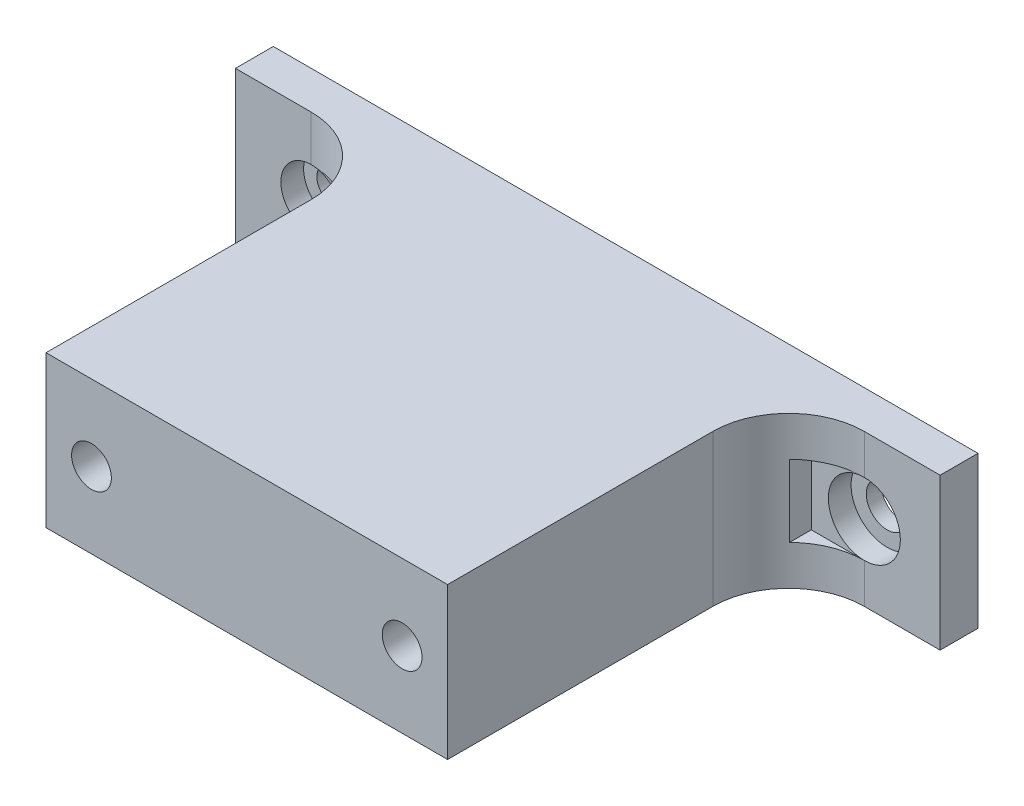
ISO-10303-21;
HEADER;
FILE_DESCRIPTION(('STEP AP214'),'2;1');
FILE_NAME('part.step','',(''),(''),'','','');
FILE_SCHEMA(('AUTOMOTIVE_DESIGN { 1 0 10303 214 1 1 1 1 }'));
ENDSEC;
DATA;
#1=APPLICATION_CONTEXT('core data for automotive mechanical design processes');
#2=APPLICATION_PROTOCOL_DEFINITION('international standard','automotive_design',2000,#1);
#3=PRODUCT_CONTEXT('',#1,'mechanical');
#4=PRODUCT('Part','Part','',(#3));
#5=PRODUCT_RELATED_PRODUCT_CATEGORY('part','',(#4));
#6=PRODUCT_DEFINITION_FORMATION('','',#4);
#7=PRODUCT_DEFINITION_CONTEXT('part definition',#1,'design');
#8=PRODUCT_DEFINITION('design','',#6,#7);
#9=PRODUCT_DEFINITION_SHAPE('','',#8);
#10=(LENGTH_UNIT() NAMED_UNIT(*) SI_UNIT(.MILLI.,.METRE.));
#11=(NAMED_UNIT(*) PLANE_ANGLE_UNIT() SI_UNIT($,.RADIAN.));
#12=(NAMED_UNIT(*) SI_UNIT($,.STERADIAN.) SOLID_ANGLE_UNIT());
#13=UNCERTAINTY_MEASURE_WITH_UNIT(LENGTH_MEASURE(1.E-05),#10,'distance_accuracy_value','');
#14=(GEOMETRIC_REPRESENTATION_CONTEXT(3) GLOBAL_UNCERTAINTY_ASSIGNED_CONTEXT((#13)) GLOBAL_UNIT_ASSIGNED_CONTEXT((#10,
#11,#12)) REPRESENTATION_CONTEXT('',''));
#15=CARTESIAN_POINT('',(0.,0.,0.));
#16=DIRECTION('',(0.,0.,1.));
#17=DIRECTION('',(1.,0.,0.));
#18=AXIS2_PLACEMENT_3D('',#15,#16,#17);
#19=CARTESIAN_POINT('',(-36.5,0.,5.));
#20=DIRECTION('',(0.,0.,1.));
#21=DIRECTION('',(1.,0.,0.));
#22=AXIS2_PLACEMENT_3D('',#19,#20,#21);
#23=CYLINDRICAL_SURFACE('',#22,4.);
#24=CARTESIAN_POINT('',(-36.5,0.,2.));
#25=DIRECTION('',(0.,0.,1.));
#26=DIRECTION('',(1.,0.,0.));
#27=AXIS2_PLACEMENT_3D('',#24,#25,#26);
#28=CIRCLE('',#27,4.);
#29=CARTESIAN_POINT('',(-32.5,0.,2.));
#30=VERTEX_POINT('',#29);
#31=EDGE_CURVE('E210',#30,#30,#28,.T.);
#32=ORIENTED_EDGE('',*,*,#31,.F.);
#33=EDGE_LOOP('',(#32));
#34=FACE_BOUND('',#33,.T.);
#35=CARTESIAN_POINT('',(-36.5,0.,5.));
#36=DIRECTION('',(0.,0.,1.));
#37=DIRECTION('',(1.,0.,0.));
#38=AXIS2_PLACEMENT_3D('',#35,#36,#37);
#39=CIRCLE('',#38,4.);
#40=CARTESIAN_POINT('',(-36.5,4.,5.));
#41=VERTEX_POINT('',#40);
#42=CARTESIAN_POINT('',(-36.5,-4.,5.));
#43=VERTEX_POINT('',#42);
#44=EDGE_CURVE('E163',#41,#43,#39,.F.);
#45=ORIENTED_EDGE('',*,*,#44,.F.);
#46=CARTESIAN_POINT('',(-36.5,0.,5.));
#47=DIRECTION('',(0.,0.,1.));
#48=DIRECTION('',(1.,0.,0.));
#49=AXIS2_PLACEMENT_3D('',#46,#47,#48);
#50=CIRCLE('',#49,4.);
#51=EDGE_CURVE('E200',#41,#43,#50,.T.);
#52=ORIENTED_EDGE('',*,*,#51,.T.);
#53=EDGE_LOOP('',(#45,#52));
#54=FACE_BOUND('',#53,.T.);
#55=ADVANCED_FACE('F43',(#34,#54),#23,.F.);
#56=CARTESIAN_POINT('',(36.5,0.,5.));
#57=DIRECTION('',(0.,0.,1.));
#58=DIRECTION('',(1.,0.,0.));
#59=AXIS2_PLACEMENT_3D('',#56,#57,#58);
#60=CYLINDRICAL_SURFACE('',#59,4.75);
#61=CARTESIAN_POINT('',(36.5,0.,2.));
#62=DIRECTION('',(0.,0.,1.));
#63=DIRECTION('',(1.,0.,0.));
#64=AXIS2_PLACEMENT_3D('',#61,#62,#63);
#65=CIRCLE('',#64,4.75);
#66=CARTESIAN_POINT('',(41.25,0.,2.));
#67=VERTEX_POINT('',#66);
#68=EDGE_CURVE('E377',#67,#67,#65,.T.);
#69=ORIENTED_EDGE('',*,*,#68,.F.);
#70=EDGE_LOOP('',(#69));
#71=FACE_BOUND('',#70,.T.);
#72=CARTESIAN_POINT('',(36.5,0.,5.));
#73=DIRECTION('',(0.,0.,1.));
#74=DIRECTION('',(1.,0.,0.));
#75=AXIS2_PLACEMENT_3D('',#72,#73,#74);
#76=CIRCLE('',#75,4.75);
#77=CARTESIAN_POINT('',(36.5,-4.75,5.));
#78=VERTEX_POINT('',#77);
#79=CARTESIAN_POINT('',(36.5,4.75,5.));
#80=VERTEX_POINT('',#79);
#81=EDGE_CURVE('E174',#78,#80,#76,.F.);
#82=ORIENTED_EDGE('',*,*,#81,.F.);
#83=CARTESIAN_POINT('',(36.5,0.,5.));
#84=DIRECTION('',(0.,0.,1.));
#85=DIRECTION('',(1.,0.,0.));
#86=AXIS2_PLACEMENT_3D('',#83,#84,#85);
#87=CIRCLE('',#86,4.75);
#88=EDGE_CURVE('E368',#78,#80,#87,.T.);
#89=ORIENTED_EDGE('',*,*,#88,.T.);
#90=EDGE_LOOP('',(#82,#89));
#91=FACE_BOUND('',#90,.T.);
#92=ADVANCED_FACE('F367',(#71,#91),#60,.F.);
#93=CARTESIAN_POINT('',(36.5,10.,15.));
#94=DIRECTION('',(0.,1.,0.));
#95=DIRECTION('',(0.,0.,1.));
#96=AXIS2_PLACEMENT_3D('',#93,#94,#95);
#97=CYLINDRICAL_SURFACE('',#96,10.);
#98=CARTESIAN_POINT('',(36.5,4.75,15.));
#99=DIRECTION('',(0.,-1.,0.));
#100=DIRECTION('',(1.,0.,0.));
#101=AXIS2_PLACEMENT_3D('',#98,#99,#100);
#102=CIRCLE('',#101,10.);
#103=CARTESIAN_POINT('',(29.5,4.75,7.85857157145715));
#104=VERTEX_POINT('',#103);
#105=EDGE_CURVE('E11',#80,#104,#102,.F.);
#106=ORIENTED_EDGE('',*,*,#105,.F.);
#107=DIRECTION('',(0.,-1.,0.));
#108=VECTOR('',#107,1.);
#109=CARTESIAN_POINT('',(36.5,-9.99999999999999,5.));
#110=LINE('',#109,#108);
#111=CARTESIAN_POINT('',(36.5,10.,5.));
#112=VERTEX_POINT('',#111);
#113=EDGE_CURVE('E310',#112,#80,#110,.T.);
#114=ORIENTED_EDGE('',*,*,#113,.F.);
#115=CARTESIAN_POINT('',(36.5,10.,15.));
#116=DIRECTION('',(0.,-1.,0.));
#117=DIRECTION('',(0.,0.,-1.));
#118=AXIS2_PLACEMENT_3D('',#115,#116,#117);
#119=CIRCLE('',#118,10.);
#120=CARTESIAN_POINT('',(26.5,10.,15.));
#121=VERTEX_POINT('',#120);
#122=EDGE_CURVE('E324',#121,#112,#119,.T.);
#123=ORIENTED_EDGE('',*,*,#122,.F.);
#124=DIRECTION('',(0.,-1.,0.));
#125=VECTOR('',#124,1.);
#126=CARTESIAN_POINT('',(26.5,10.,15.));
#127=LINE('',#126,#125);
#128=CARTESIAN_POINT('',(26.5,-9.99999999999999,15.));
#129=VERTEX_POINT('',#128);
#130=EDGE_CURVE('E314',#129,#121,#127,.F.);
#131=ORIENTED_EDGE('',*,*,#130,.F.);
#132=CARTESIAN_POINT('',(36.5,-9.99999999999999,15.));
#133=DIRECTION('',(0.,1.,0.));
#134=DIRECTION('',(0.,0.,1.));
#135=AXIS2_PLACEMENT_3D('',#132,#133,#134);
#136=CIRCLE('',#135,10.);
#137=CARTESIAN_POINT('',(36.5,-9.99999999999999,5.));
#138=VERTEX_POINT('',#137);
#139=EDGE_CURVE('E321',#138,#129,#136,.T.);
#140=ORIENTED_EDGE('',*,*,#139,.F.);
#141=DIRECTION('',(0.,-1.,0.));
#142=VECTOR('',#141,1.);
#143=CARTESIAN_POINT('',(36.5,-9.99999999999999,5.));
#144=LINE('',#143,#142);
#145=EDGE_CURVE('E298',#78,#138,#144,.T.);
#146=ORIENTED_EDGE('',*,*,#145,.F.);
#147=CARTESIAN_POINT('',(36.5,-4.75,15.));
#148=DIRECTION('',(0.,1.,0.));
#149=DIRECTION('',(-1.,0.,0.));
#150=AXIS2_PLACEMENT_3D('',#147,#148,#149);
#151=CIRCLE('',#150,10.);
#152=CARTESIAN_POINT('',(29.5,-4.75,7.85857157145715));
#153=VERTEX_POINT('',#152);
#154=EDGE_CURVE('E195',#153,#78,#151,.F.);
#155=ORIENTED_EDGE('',*,*,#154,.F.);
#156=DIRECTION('',(0.,1.,0.));
#157=VECTOR('',#156,1.);
#158=CARTESIAN_POINT('',(29.5,10.,7.85857157145715));
#159=LINE('',#158,#157);
#160=EDGE_CURVE('E52',#104,#153,#159,.F.);
#161=ORIENTED_EDGE('',*,*,#160,.F.);
#162=EDGE_LOOP('',(#106,#114,#123,#131,#140,#146,#155,#161));
#163=FACE_BOUND('',#162,.T.);
#164=ADVANCED_FACE('F351',(#163),#97,.F.);
#165=CARTESIAN_POINT('',(-36.5,10.,15.));
#166=DIRECTION('',(0.,-1.,0.));
#167=DIRECTION('',(1.,0.,0.));
#168=AXIS2_PLACEMENT_3D('',#165,#166,#167);
#169=CYLINDRICAL_SURFACE('',#168,10.);
#170=CARTESIAN_POINT('',(-36.5,-4.,15.));
#171=DIRECTION('',(0.,1.,0.));
#172=DIRECTION('',(-1.,0.,0.));
#173=AXIS2_PLACEMENT_3D('',#170,#171,#172);
#174=CIRCLE('',#173,10.);
#175=CARTESIAN_POINT('',(-30.5,-4.,7.00000000000001));
#176=VERTEX_POINT('',#175);
#177=EDGE_CURVE('E180',#43,#176,#174,.F.);
#178=ORIENTED_EDGE('',*,*,#177,.F.);
#179=DIRECTION('',(0.,1.,0.));
#180=VECTOR('',#179,1.);
#181=CARTESIAN_POINT('',(-36.5,10.,5.));
#182=LINE('',#181,#180);
#183=CARTESIAN_POINT('',(-36.5,-10.,5.));
#184=VERTEX_POINT('',#183);
#185=EDGE_CURVE('E191',#184,#43,#182,.T.);
#186=ORIENTED_EDGE('',*,*,#185,.F.);
#187=CARTESIAN_POINT('',(-36.5,-9.99999999999999,15.));
#188=DIRECTION('',(0.,1.,0.));
#189=DIRECTION('',(0.,0.,1.));
#190=AXIS2_PLACEMENT_3D('',#187,#188,#189);
#191=CIRCLE('',#190,10.);
#192=CARTESIAN_POINT('',(-26.5,-9.99999999999999,15.));
#193=VERTEX_POINT('',#192);
#194=EDGE_CURVE('E330',#193,#184,#191,.T.);
#195=ORIENTED_EDGE('',*,*,#194,.F.);
#196=DIRECTION('',(0.,1.,0.));
#197=VECTOR('',#196,1.);
#198=CARTESIAN_POINT('',(-26.5,-9.99999999999999,15.));
#199=LINE('',#198,#197);
#200=CARTESIAN_POINT('',(-26.5,10.,15.));
#201=VERTEX_POINT('',#200);
#202=EDGE_CURVE('E206',#201,#193,#199,.F.);
#203=ORIENTED_EDGE('',*,*,#202,.F.);
#204=CARTESIAN_POINT('',(-36.5,10.,15.));
#205=DIRECTION('',(0.,-1.,0.));
#206=DIRECTION('',(0.,0.,-1.));
#207=AXIS2_PLACEMENT_3D('',#204,#205,#206);
#208=CIRCLE('',#207,10.);
#209=CARTESIAN_POINT('',(-36.5,10.,5.));
#210=VERTEX_POINT('',#209);
#211=EDGE_CURVE('E327',#210,#201,#208,.T.);
#212=ORIENTED_EDGE('',*,*,#211,.F.);
#213=DIRECTION('',(0.,1.,0.));
#214=VECTOR('',#213,1.);
#215=CARTESIAN_POINT('',(-36.5,10.,5.));
#216=LINE('',#215,#214);
#217=EDGE_CURVE('E207',#41,#210,#216,.T.);
#218=ORIENTED_EDGE('',*,*,#217,.F.);
#219=CARTESIAN_POINT('',(-36.5,4.,15.));
#220=DIRECTION('',(0.,-1.,0.));
#221=DIRECTION('',(1.,0.,0.));
#222=AXIS2_PLACEMENT_3D('',#219,#220,#221);
#223=CIRCLE('',#222,10.);
#224=CARTESIAN_POINT('',(-30.5,4.,7.));
#225=VERTEX_POINT('',#224);
#226=EDGE_CURVE('E333',#225,#41,#223,.F.);
#227=ORIENTED_EDGE('',*,*,#226,.F.);
#228=DIRECTION('',(0.,-1.,0.));
#229=VECTOR('',#228,1.);
#230=CARTESIAN_POINT('',(-30.5,10.,7.));
#231=LINE('',#230,#229);
#232=EDGE_CURVE('E193',#176,#225,#231,.F.);
#233=ORIENTED_EDGE('',*,*,#232,.F.);
#234=EDGE_LOOP('',(#178,#186,#195,#203,#212,#218,#227,#233));
#235=FACE_BOUND('',#234,.T.);
#236=ADVANCED_FACE('F45',(#235),#169,.F.);
#237=CARTESIAN_POINT('',(26.5,10.,50.));
#238=DIRECTION('',(-1.,0.,0.));
#239=DIRECTION('',(0.,0.,1.));
#240=AXIS2_PLACEMENT_3D('',#237,#238,#239);
#241=PLANE('',#240);
#242=DIRECTION('',(0.,0.,-1.));
#243=VECTOR('',#242,1.);
#244=CARTESIAN_POINT('',(26.5,-9.99999999999999,50.));
#245=LINE('',#244,#243);
#246=CARTESIAN_POINT('',(26.5,-9.99999999999999,50.));
#247=VERTEX_POINT('',#246);
#248=EDGE_CURVE('E278',#247,#129,#245,.T.);
#249=ORIENTED_EDGE('',*,*,#248,.T.);
#250=ORIENTED_EDGE('',*,*,#130,.T.);
#251=DIRECTION('',(0.,0.,-1.));
#252=VECTOR('',#251,1.);
#253=CARTESIAN_POINT('',(26.5,10.,50.));
#254=LINE('',#253,#252);
#255=CARTESIAN_POINT('',(26.5,10.,50.));
#256=VERTEX_POINT('',#255);
#257=EDGE_CURVE('E294',#256,#121,#254,.T.);
#258=ORIENTED_EDGE('',*,*,#257,.F.);
#259=DIRECTION('',(0.,1.,0.));
#260=VECTOR('',#259,1.);
#261=CARTESIAN_POINT('',(26.5,10.,50.));
#262=LINE('',#261,#260);
#263=EDGE_CURVE('E264',#247,#256,#262,.T.);
#264=ORIENTED_EDGE('',*,*,#263,.F.);
#265=EDGE_LOOP('',(#249,#250,#258,#264));
#266=FACE_BOUND('',#265,.T.);
#267=ADVANCED_FACE('F408',(#266),#241,.F.);
#268=CARTESIAN_POINT('',(-26.5,10.,50.));
#269=DIRECTION('',(1.,0.,0.));
#270=DIRECTION('',(0.,1.,0.));
#271=AXIS2_PLACEMENT_3D('',#268,#269,#270);
#272=PLANE('',#271);
#273=DIRECTION('',(0.,0.,-1.));
#274=VECTOR('',#273,1.);
#275=CARTESIAN_POINT('',(-26.5,10.,50.));
#276=LINE('',#275,#274);
#277=CARTESIAN_POINT('',(-26.5,10.,50.));
#278=VERTEX_POINT('',#277);
#279=EDGE_CURVE('E290',#278,#201,#276,.T.);
#280=ORIENTED_EDGE('',*,*,#279,.T.);
#281=ORIENTED_EDGE('',*,*,#202,.T.);
#282=DIRECTION('',(0.,0.,-1.));
#283=VECTOR('',#282,1.);
#284=CARTESIAN_POINT('',(-26.5,-9.99999999999999,50.));
#285=LINE('',#284,#283);
#286=CARTESIAN_POINT('',(-26.5,-9.99999999999999,50.));
#287=VERTEX_POINT('',#286);
#288=EDGE_CURVE('E286',#287,#193,#285,.T.);
#289=ORIENTED_EDGE('',*,*,#288,.F.);
#290=DIRECTION('',(0.,-1.,0.));
#291=VECTOR('',#290,1.);
#292=CARTESIAN_POINT('',(-26.5,10.,50.));
#293=LINE('',#292,#291);
#294=EDGE_CURVE('E272',#278,#287,#293,.T.);
#295=ORIENTED_EDGE('',*,*,#294,.F.);
#296=EDGE_LOOP('',(#280,#281,#289,#295));
#297=FACE_BOUND('',#296,.T.);
#298=ADVANCED_FACE('F422',(#297),#272,.F.);
#299=CARTESIAN_POINT('',(-26.5,10.,50.));
#300=DIRECTION('',(0.,-1.,0.));
#301=DIRECTION('',(0.,0.,-1.));
#302=AXIS2_PLACEMENT_3D('',#299,#300,#301);
#303=PLANE('',#302);
#304=DIRECTION('',(-1.,0.,0.));
#305=VECTOR('',#304,1.);
#306=CARTESIAN_POINT('',(-26.5,10.,0.));
#307=LINE('',#306,#305);
#308=CARTESIAN_POINT('',(46.5,10.,0.));
#309=VERTEX_POINT('',#308);
#310=CARTESIAN_POINT('',(-46.5,10.,0.));
#311=VERTEX_POINT('',#310);
#312=EDGE_CURVE('E263',#309,#311,#307,.T.);
#313=ORIENTED_EDGE('',*,*,#312,.T.);
#314=DIRECTION('',(0.,0.,-1.));
#315=VECTOR('',#314,1.);
#316=CARTESIAN_POINT('',(-46.5,10.,0.));
#317=LINE('',#316,#315);
#318=CARTESIAN_POINT('',(-46.5,10.,5.));
#319=VERTEX_POINT('',#318);
#320=EDGE_CURVE('E237',#319,#311,#317,.T.);
#321=ORIENTED_EDGE('',*,*,#320,.F.);
#322=DIRECTION('',(1.,0.,0.));
#323=VECTOR('',#322,1.);
#324=CARTESIAN_POINT('',(-46.5,10.,5.));
#325=LINE('',#324,#323);
#326=EDGE_CURVE('E241',#319,#210,#325,.T.);
#327=ORIENTED_EDGE('',*,*,#326,.T.);
#328=ORIENTED_EDGE('',*,*,#211,.T.);
#329=ORIENTED_EDGE('',*,*,#279,.F.);
#330=DIRECTION('',(-1.,0.,0.));
#331=VECTOR('',#330,1.);
#332=CARTESIAN_POINT('',(-26.5,10.,50.));
#333=LINE('',#332,#331);
#334=EDGE_CURVE('E268',#256,#278,#333,.T.);
#335=ORIENTED_EDGE('',*,*,#334,.F.);
#336=ORIENTED_EDGE('',*,*,#257,.T.);
#337=ORIENTED_EDGE('',*,*,#122,.T.);
#338=DIRECTION('',(-1.,0.,0.));
#339=VECTOR('',#338,1.);
#340=CARTESIAN_POINT('',(46.5,10.,5.));
#341=LINE('',#340,#339);
#342=CARTESIAN_POINT('',(46.5,10.,5.));
#343=VERTEX_POINT('',#342);
#344=EDGE_CURVE('E211',#343,#112,#341,.T.);
#345=ORIENTED_EDGE('',*,*,#344,.F.);
#346=DIRECTION('',(0.,0.,1.));
#347=VECTOR('',#346,1.);
#348=CARTESIAN_POINT('',(46.5,10.,0.));
#349=LINE('',#348,#347);
#350=EDGE_CURVE('E389',#309,#343,#349,.T.);
#351=ORIENTED_EDGE('',*,*,#350,.F.);
#352=EDGE_LOOP('',(#313,#321,#327,#328,#329,#335,#336,#337,#345,#351));
#353=FACE_BOUND('',#352,.T.);
#354=ADVANCED_FACE('F411',(#353),#303,.F.);
#355=CARTESIAN_POINT('',(-26.5,-9.99999999999999,50.));
#356=DIRECTION('',(0.,1.,0.));
#357=DIRECTION('',(0.,0.,1.));
#358=AXIS2_PLACEMENT_3D('',#355,#356,#357);
#359=PLANE('',#358);
#360=DIRECTION('',(1.,0.,0.));
#361=VECTOR('',#360,1.);
#362=CARTESIAN_POINT('',(-26.5,-9.99999999999999,0.));
#363=LINE('',#362,#361);
#364=CARTESIAN_POINT('',(-46.5,-10.,0.));
#365=VERTEX_POINT('',#364);
#366=CARTESIAN_POINT('',(46.5,-9.99999999999999,0.));
#367=VERTEX_POINT('',#366);
#368=EDGE_CURVE('E269',#365,#367,#363,.T.);
#369=ORIENTED_EDGE('',*,*,#368,.T.);
#370=DIRECTION('',(0.,0.,-1.));
#371=VECTOR('',#370,1.);
#372=CARTESIAN_POINT('',(46.5,-9.99999999999999,0.));
#373=LINE('',#372,#371);
#374=CARTESIAN_POINT('',(46.5,-9.99999999999999,5.));
#375=VERTEX_POINT('',#374);
#376=EDGE_CURVE('E395',#375,#367,#373,.T.);
#377=ORIENTED_EDGE('',*,*,#376,.F.);
#378=DIRECTION('',(-1.,0.,0.));
#379=VECTOR('',#378,1.);
#380=CARTESIAN_POINT('',(46.5,-9.99999999999999,5.));
#381=LINE('',#380,#379);
#382=EDGE_CURVE('E219',#375,#138,#381,.T.);
#383=ORIENTED_EDGE('',*,*,#382,.T.);
#384=ORIENTED_EDGE('',*,*,#139,.T.);
#385=ORIENTED_EDGE('',*,*,#248,.F.);
#386=DIRECTION('',(1.,0.,0.));
#387=VECTOR('',#386,1.);
#388=CARTESIAN_POINT('',(-26.5,-9.99999999999999,50.));
#389=LINE('',#388,#387);
#390=EDGE_CURVE('E275',#287,#247,#389,.T.);
#391=ORIENTED_EDGE('',*,*,#390,.F.);
#392=ORIENTED_EDGE('',*,*,#288,.T.);
#393=ORIENTED_EDGE('',*,*,#194,.T.);
#394=DIRECTION('',(1.,0.,0.));
#395=VECTOR('',#394,1.);
#396=CARTESIAN_POINT('',(-46.5,-10.,5.));
#397=LINE('',#396,#395);
#398=CARTESIAN_POINT('',(-46.5,-10.,5.));
#399=VERTEX_POINT('',#398);
#400=EDGE_CURVE('E204',#399,#184,#397,.T.);
#401=ORIENTED_EDGE('',*,*,#400,.F.);
#402=DIRECTION('',(0.,0.,1.));
#403=VECTOR('',#402,1.);
#404=CARTESIAN_POINT('',(-46.5,-10.,0.));
#405=LINE('',#404,#403);
#406=EDGE_CURVE('E231',#365,#399,#405,.T.);
#407=ORIENTED_EDGE('',*,*,#406,.F.);
#408=EDGE_LOOP('',(#369,#377,#383,#384,#385,#391,#392,#393,#401,#407));
#409=FACE_BOUND('',#408,.T.);
#410=ADVANCED_FACE('F401',(#409),#359,.F.);
#411=CARTESIAN_POINT('',(0.,0.,50.));
#412=DIRECTION('',(0.,0.,1.));
#413=DIRECTION('',(1.,0.,0.));
#414=AXIS2_PLACEMENT_3D('',#411,#412,#413);
#415=PLANE('',#414);
#416=CARTESIAN_POINT('',(20.5,0.,50.));
#417=DIRECTION('',(0.,0.,1.));
#418=DIRECTION('',(1.,0.,0.));
#419=AXIS2_PLACEMENT_3D('',#416,#417,#418);
#420=CIRCLE('',#419,2.625);
#421=CARTESIAN_POINT('',(23.125,0.,50.));
#422=VERTEX_POINT('',#421);
#423=EDGE_CURVE('E247',#422,#422,#420,.T.);
#424=ORIENTED_EDGE('',*,*,#423,.F.);
#425=EDGE_LOOP('',(#424));
#426=FACE_BOUND('',#425,.T.);
#427=CARTESIAN_POINT('',(-20.5,0.,50.));
#428=DIRECTION('',(0.,0.,1.));
#429=DIRECTION('',(1.,0.,0.));
#430=AXIS2_PLACEMENT_3D('',#427,#428,#429);
#431=CIRCLE('',#430,2.625);
#432=CARTESIAN_POINT('',(-17.875,0.,50.));
#433=VERTEX_POINT('',#432);
#434=EDGE_CURVE('E255',#433,#433,#431,.T.);
#435=ORIENTED_EDGE('',*,*,#434,.F.);
#436=EDGE_LOOP('',(#435));
#437=FACE_BOUND('',#436,.T.);
#438=ORIENTED_EDGE('',*,*,#263,.T.);
#439=ORIENTED_EDGE('',*,*,#334,.T.);
#440=ORIENTED_EDGE('',*,*,#294,.T.);
#441=ORIENTED_EDGE('',*,*,#390,.T.);
#442=EDGE_LOOP('',(#438,#439,#440,#441));
#443=FACE_BOUND('',#442,.T.);
#444=ADVANCED_FACE('F416',(#426,#437,#443),#415,.T.);
#445=CARTESIAN_POINT('',(0.,0.,0.));
#446=DIRECTION('',(0.,0.,1.));
#447=DIRECTION('',(1.,0.,0.));
#448=AXIS2_PLACEMENT_3D('',#445,#446,#447);
#449=PLANE('',#448);
#450=CARTESIAN_POINT('',(36.5,0.,0.));
#451=DIRECTION('',(0.,0.,1.));
#452=DIRECTION('',(1.,0.,0.));
#453=AXIS2_PLACEMENT_3D('',#450,#451,#452);
#454=CIRCLE('',#453,2.75);
#455=CARTESIAN_POINT('',(39.25,0.,0.));
#456=VERTEX_POINT('',#455);
#457=EDGE_CURVE('E302',#456,#456,#454,.T.);
#458=ORIENTED_EDGE('',*,*,#457,.T.);
#459=EDGE_LOOP('',(#458));
#460=FACE_BOUND('',#459,.T.);
#461=CARTESIAN_POINT('',(-36.5,0.,0.));
#462=DIRECTION('',(0.,0.,1.));
#463=DIRECTION('',(1.,0.,0.));
#464=AXIS2_PLACEMENT_3D('',#461,#462,#463);
#465=CIRCLE('',#464,2.25);
#466=CARTESIAN_POINT('',(-34.25,0.,0.));
#467=VERTEX_POINT('',#466);
#468=EDGE_CURVE('E226',#467,#467,#465,.T.);
#469=ORIENTED_EDGE('',*,*,#468,.T.);
#470=EDGE_LOOP('',(#469));
#471=FACE_BOUND('',#470,.T.);
#472=ORIENTED_EDGE('',*,*,#312,.F.);
#473=DIRECTION('',(0.,1.,0.));
#474=VECTOR('',#473,1.);
#475=CARTESIAN_POINT('',(46.5,10.,0.));
#476=LINE('',#475,#474);
#477=EDGE_CURVE('E306',#367,#309,#476,.T.);
#478=ORIENTED_EDGE('',*,*,#477,.F.);
#479=ORIENTED_EDGE('',*,*,#368,.F.);
#480=DIRECTION('',(0.,-1.,0.));
#481=VECTOR('',#480,1.);
#482=CARTESIAN_POINT('',(-46.5,10.,0.));
#483=LINE('',#482,#481);
#484=EDGE_CURVE('E227',#311,#365,#483,.T.);
#485=ORIENTED_EDGE('',*,*,#484,.F.);
#486=EDGE_LOOP('',(#472,#478,#479,#485));
#487=FACE_BOUND('',#486,.T.);
#488=ADVANCED_FACE('F473',(#460,#471,#487),#449,.F.);
#489=CARTESIAN_POINT('',(-20.5,0.,35.));
#490=DIRECTION('',(0.,0.,1.));
#491=DIRECTION('',(1.,0.,0.));
#492=AXIS2_PLACEMENT_3D('',#489,#490,#491);
#493=CONICAL_SURFACE('',#492,2.625,1.02974425867665);
#494=CARTESIAN_POINT('',(-20.5,0.,33.4227408750527));
#495=VERTEX_POINT('',#494);
#496=VERTEX_LOOP('',#495);
#497=FACE_BOUND('',#496,.T.);
#498=CARTESIAN_POINT('',(-20.5,0.,35.));
#499=DIRECTION('',(0.,0.,1.));
#500=DIRECTION('',(1.,0.,0.));
#501=AXIS2_PLACEMENT_3D('',#498,#499,#500);
#502=CIRCLE('',#501,2.625);
#503=CARTESIAN_POINT('',(-17.875,0.,35.));
#504=VERTEX_POINT('',#503);
#505=EDGE_CURVE('E259',#504,#504,#502,.T.);
#506=ORIENTED_EDGE('',*,*,#505,.T.);
#507=EDGE_LOOP('',(#506));
#508=FACE_BOUND('',#507,.T.);
#509=ADVANCED_FACE('F469',(#497,#508),#493,.F.);
#510=CARTESIAN_POINT('',(-20.5,0.,50.));
#511=DIRECTION('',(0.,0.,1.));
#512=DIRECTION('',(1.,0.,0.));
#513=AXIS2_PLACEMENT_3D('',#510,#511,#512);
#514=CYLINDRICAL_SURFACE('',#513,2.625);
#515=ORIENTED_EDGE('',*,*,#505,.F.);
#516=EDGE_LOOP('',(#515));
#517=FACE_BOUND('',#516,.T.);
#518=ORIENTED_EDGE('',*,*,#434,.T.);
#519=EDGE_LOOP('',(#518));
#520=FACE_BOUND('',#519,.T.);
#521=ADVANCED_FACE('F465',(#517,#520),#514,.F.);
#522=CARTESIAN_POINT('',(20.5,0.,35.));
#523=DIRECTION('',(0.,0.,1.));
#524=DIRECTION('',(1.,0.,0.));
#525=AXIS2_PLACEMENT_3D('',#522,#523,#524);
#526=CONICAL_SURFACE('',#525,2.625,1.02974425867665);
#527=CARTESIAN_POINT('',(20.5,0.,33.4227408750527));
#528=VERTEX_POINT('',#527);
#529=VERTEX_LOOP('',#528);
#530=FACE_BOUND('',#529,.T.);
#531=CARTESIAN_POINT('',(20.5,0.,35.));
#532=DIRECTION('',(0.,0.,1.));
#533=DIRECTION('',(1.,0.,0.));
#534=AXIS2_PLACEMENT_3D('',#531,#532,#533);
#535=CIRCLE('',#534,2.625);
#536=CARTESIAN_POINT('',(23.125,0.,35.));
#537=VERTEX_POINT('',#536);
#538=EDGE_CURVE('E251',#537,#537,#535,.T.);
#539=ORIENTED_EDGE('',*,*,#538,.T.);
#540=EDGE_LOOP('',(#539));
#541=FACE_BOUND('',#540,.T.);
#542=ADVANCED_FACE('F461',(#530,#541),#526,.F.);
#543=CARTESIAN_POINT('',(20.5,0.,50.));
#544=DIRECTION('',(0.,0.,1.));
#545=DIRECTION('',(1.,0.,0.));
#546=AXIS2_PLACEMENT_3D('',#543,#544,#545);
#547=CYLINDRICAL_SURFACE('',#546,2.625);
#548=ORIENTED_EDGE('',*,*,#538,.F.);
#549=EDGE_LOOP('',(#548));
#550=FACE_BOUND('',#549,.T.);
#551=ORIENTED_EDGE('',*,*,#423,.T.);
#552=EDGE_LOOP('',(#551));
#553=FACE_BOUND('',#552,.T.);
#554=ADVANCED_FACE('F458',(#550,#553),#547,.F.);
#555=CARTESIAN_POINT('',(-46.5,10.,5.));
#556=DIRECTION('',(0.,0.,-1.));
#557=DIRECTION('',(0.,1.,0.));
#558=AXIS2_PLACEMENT_3D('',#555,#556,#557);
#559=PLANE('',#558);
#560=ORIENTED_EDGE('',*,*,#400,.T.);
#561=ORIENTED_EDGE('',*,*,#185,.T.);
#562=ORIENTED_EDGE('',*,*,#51,.F.);
#563=ORIENTED_EDGE('',*,*,#217,.T.);
#564=ORIENTED_EDGE('',*,*,#326,.F.);
#565=DIRECTION('',(0.,1.,0.));
#566=VECTOR('',#565,1.);
#567=CARTESIAN_POINT('',(-46.5,10.,5.));
#568=LINE('',#567,#566);
#569=EDGE_CURVE('E234',#399,#319,#568,.T.);
#570=ORIENTED_EDGE('',*,*,#569,.F.);
#571=EDGE_LOOP('',(#560,#561,#562,#563,#564,#570));
#572=FACE_BOUND('',#571,.T.);
#573=ADVANCED_FACE('F199',(#572),#559,.F.);
#574=CARTESIAN_POINT('',(-46.5,0.,0.));
#575=DIRECTION('',(-1.,0.,0.));
#576=DIRECTION('',(0.,-1.,0.));
#577=AXIS2_PLACEMENT_3D('',#574,#575,#576);
#578=PLANE('',#577);
#579=ORIENTED_EDGE('',*,*,#484,.T.);
#580=ORIENTED_EDGE('',*,*,#406,.T.);
#581=ORIENTED_EDGE('',*,*,#569,.T.);
#582=ORIENTED_EDGE('',*,*,#320,.T.);
#583=EDGE_LOOP('',(#579,#580,#581,#582));
#584=FACE_BOUND('',#583,.T.);
#585=ADVANCED_FACE('F451',(#584),#578,.T.);
#586=CARTESIAN_POINT('',(-36.5,0.,5.));
#587=DIRECTION('',(0.,0.,1.));
#588=DIRECTION('',(1.,0.,0.));
#589=AXIS2_PLACEMENT_3D('',#586,#587,#588);
#590=CYLINDRICAL_SURFACE('',#589,2.25);
#591=CARTESIAN_POINT('',(-36.5,0.,2.));
#592=DIRECTION('',(0.,0.,1.));
#593=DIRECTION('',(1.,0.,0.));
#594=AXIS2_PLACEMENT_3D('',#591,#592,#593);
#595=CIRCLE('',#594,2.25);
#596=CARTESIAN_POINT('',(-34.25,0.,2.));
#597=VERTEX_POINT('',#596);
#598=EDGE_CURVE('E216',#597,#597,#595,.T.);
#599=ORIENTED_EDGE('',*,*,#598,.T.);
#600=EDGE_LOOP('',(#599));
#601=FACE_BOUND('',#600,.T.);
#602=ORIENTED_EDGE('',*,*,#468,.F.);
#603=EDGE_LOOP('',(#602));
#604=FACE_BOUND('',#603,.T.);
#605=ADVANCED_FACE('F447',(#601,#604),#590,.F.);
#606=CARTESIAN_POINT('',(-34.25,0.,2.));
#607=DIRECTION('',(0.,0.,-1.));
#608=DIRECTION('',(-1.,0.,0.));
#609=AXIS2_PLACEMENT_3D('',#606,#607,#608);
#610=PLANE('',#609);
#611=ORIENTED_EDGE('',*,*,#598,.F.);
#612=EDGE_LOOP('',(#611));
#613=FACE_BOUND('',#612,.T.);
#614=ORIENTED_EDGE('',*,*,#31,.T.);
#615=EDGE_LOOP('',(#614));
#616=FACE_BOUND('',#615,.T.);
#617=ADVANCED_FACE('F444',(#613,#616),#610,.F.);
#618=CARTESIAN_POINT('',(46.5,10.,5.));
#619=DIRECTION('',(0.,0.,-1.));
#620=DIRECTION('',(0.,1.,0.));
#621=AXIS2_PLACEMENT_3D('',#618,#619,#620);
#622=PLANE('',#621);
#623=ORIENTED_EDGE('',*,*,#344,.T.);
#624=ORIENTED_EDGE('',*,*,#113,.T.);
#625=ORIENTED_EDGE('',*,*,#88,.F.);
#626=ORIENTED_EDGE('',*,*,#145,.T.);
#627=ORIENTED_EDGE('',*,*,#382,.F.);
#628=DIRECTION('',(0.,-1.,0.));
#629=VECTOR('',#628,1.);
#630=CARTESIAN_POINT('',(46.5,10.,5.));
#631=LINE('',#630,#629);
#632=EDGE_CURVE('E392',#343,#375,#631,.T.);
#633=ORIENTED_EDGE('',*,*,#632,.F.);
#634=EDGE_LOOP('',(#623,#624,#625,#626,#627,#633));
#635=FACE_BOUND('',#634,.T.);
#636=ADVANCED_FACE('F372',(#635),#622,.F.);
#637=CARTESIAN_POINT('',(46.5,0.,0.));
#638=DIRECTION('',(-1.,0.,0.));
#639=DIRECTION('',(0.,0.,1.));
#640=AXIS2_PLACEMENT_3D('',#637,#638,#639);
#641=PLANE('',#640);
#642=ORIENTED_EDGE('',*,*,#477,.T.);
#643=ORIENTED_EDGE('',*,*,#350,.T.);
#644=ORIENTED_EDGE('',*,*,#632,.T.);
#645=ORIENTED_EDGE('',*,*,#376,.T.);
#646=EDGE_LOOP('',(#642,#643,#644,#645));
#647=FACE_BOUND('',#646,.T.);
#648=ADVANCED_FACE('F534',(#647),#641,.F.);
#649=CARTESIAN_POINT('',(36.5,0.,5.));
#650=DIRECTION('',(0.,0.,1.));
#651=DIRECTION('',(1.,0.,0.));
#652=AXIS2_PLACEMENT_3D('',#649,#650,#651);
#653=CYLINDRICAL_SURFACE('',#652,2.75);
#654=CARTESIAN_POINT('',(36.5,0.,2.));
#655=DIRECTION('',(0.,0.,1.));
#656=DIRECTION('',(1.,0.,0.));
#657=AXIS2_PLACEMENT_3D('',#654,#655,#656);
#658=CIRCLE('',#657,2.75);
#659=CARTESIAN_POINT('',(39.25,0.,2.));
#660=VERTEX_POINT('',#659);
#661=EDGE_CURVE('E307',#660,#660,#658,.T.);
#662=ORIENTED_EDGE('',*,*,#661,.T.);
#663=EDGE_LOOP('',(#662));
#664=FACE_BOUND('',#663,.T.);
#665=ORIENTED_EDGE('',*,*,#457,.F.);
#666=EDGE_LOOP('',(#665));
#667=FACE_BOUND('',#666,.T.);
#668=ADVANCED_FACE('F540',(#664,#667),#653,.F.);
#669=CARTESIAN_POINT('',(39.25,0.,2.));
#670=DIRECTION('',(0.,0.,-1.));
#671=DIRECTION('',(-1.,0.,0.));
#672=AXIS2_PLACEMENT_3D('',#669,#670,#671);
#673=PLANE('',#672);
#674=ORIENTED_EDGE('',*,*,#661,.F.);
#675=EDGE_LOOP('',(#674));
#676=FACE_BOUND('',#675,.T.);
#677=ORIENTED_EDGE('',*,*,#68,.T.);
#678=EDGE_LOOP('',(#677));
#679=FACE_BOUND('',#678,.T.);
#680=ADVANCED_FACE('F546',(#676,#679),#673,.F.);
#681=CARTESIAN_POINT('',(-36.5,-4.,25.));
#682=DIRECTION('',(0.,1.,0.));
#683=DIRECTION('',(-1.,0.,0.));
#684=AXIS2_PLACEMENT_3D('',#681,#682,#683);
#685=PLANE('',#684);
#686=ORIENTED_EDGE('',*,*,#177,.T.);
#687=DIRECTION('',(0.,0.,-1.));
#688=VECTOR('',#687,1.);
#689=CARTESIAN_POINT('',(-30.5,-4.,25.));
#690=LINE('',#689,#688);
#691=CARTESIAN_POINT('',(-30.5,-4.,5.));
#692=VERTEX_POINT('',#691);
#693=EDGE_CURVE('E175',#176,#692,#690,.T.);
#694=ORIENTED_EDGE('',*,*,#693,.T.);
#695=DIRECTION('',(1.,0.,0.));
#696=VECTOR('',#695,1.);
#697=CARTESIAN_POINT('',(-36.5,-4.,5.));
#698=LINE('',#697,#696);
#699=EDGE_CURVE('E167',#43,#692,#698,.T.);
#700=ORIENTED_EDGE('',*,*,#699,.F.);
#701=EDGE_LOOP('',(#686,#694,#700));
#702=FACE_BOUND('',#701,.T.);
#703=ADVANCED_FACE('F179',(#702),#685,.T.);
#704=CARTESIAN_POINT('',(-30.5,4.,25.));
#705=DIRECTION('',(-1.,0.,0.));
#706=DIRECTION('',(0.,0.,1.));
#707=AXIS2_PLACEMENT_3D('',#704,#705,#706);
#708=PLANE('',#707);
#709=ORIENTED_EDGE('',*,*,#232,.T.);
#710=DIRECTION('',(0.,0.,-1.));
#711=VECTOR('',#710,1.);
#712=CARTESIAN_POINT('',(-30.5,4.,25.));
#713=LINE('',#712,#711);
#714=CARTESIAN_POINT('',(-30.5,4.,5.));
#715=VERTEX_POINT('',#714);
#716=EDGE_CURVE('E67',#225,#715,#713,.T.);
#717=ORIENTED_EDGE('',*,*,#716,.T.);
#718=DIRECTION('',(0.,1.,0.));
#719=VECTOR('',#718,1.);
#720=CARTESIAN_POINT('',(-30.5,4.,5.));
#721=LINE('',#720,#719);
#722=EDGE_CURVE('E183',#692,#715,#721,.T.);
#723=ORIENTED_EDGE('',*,*,#722,.F.);
#724=ORIENTED_EDGE('',*,*,#693,.F.);
#725=EDGE_LOOP('',(#709,#717,#723,#724));
#726=FACE_BOUND('',#725,.T.);
#727=ADVANCED_FACE('F561',(#726),#708,.T.);
#728=CARTESIAN_POINT('',(-36.5,4.,25.));
#729=DIRECTION('',(0.,-1.,0.));
#730=DIRECTION('',(1.,0.,0.));
#731=AXIS2_PLACEMENT_3D('',#728,#729,#730);
#732=PLANE('',#731);
#733=ORIENTED_EDGE('',*,*,#226,.T.);
#734=DIRECTION('',(-1.,0.,0.));
#735=VECTOR('',#734,1.);
#736=CARTESIAN_POINT('',(-36.5,4.,5.));
#737=LINE('',#736,#735);
#738=EDGE_CURVE('E169',#715,#41,#737,.T.);
#739=ORIENTED_EDGE('',*,*,#738,.F.);
#740=ORIENTED_EDGE('',*,*,#716,.F.);
#741=EDGE_LOOP('',(#733,#739,#740));
#742=FACE_BOUND('',#741,.T.);
#743=ADVANCED_FACE('F568',(#742),#732,.T.);
#744=CARTESIAN_POINT('',(0.,0.,5.));
#745=DIRECTION('',(0.,0.,1.));
#746=DIRECTION('',(1.,0.,0.));
#747=AXIS2_PLACEMENT_3D('',#744,#745,#746);
#748=PLANE('',#747);
#749=ORIENTED_EDGE('',*,*,#44,.T.);
#750=ORIENTED_EDGE('',*,*,#699,.T.);
#751=ORIENTED_EDGE('',*,*,#722,.T.);
#752=ORIENTED_EDGE('',*,*,#738,.T.);
#753=EDGE_LOOP('',(#749,#750,#751,#752));
#754=FACE_BOUND('',#753,.T.);
#755=ADVANCED_FACE('F165',(#754),#748,.T.);
#756=CARTESIAN_POINT('',(36.5,4.75,25.));
#757=DIRECTION('',(0.,-1.,0.));
#758=DIRECTION('',(1.,0.,0.));
#759=AXIS2_PLACEMENT_3D('',#756,#757,#758);
#760=PLANE('',#759);
#761=ORIENTED_EDGE('',*,*,#105,.T.);
#762=DIRECTION('',(0.,0.,-1.));
#763=VECTOR('',#762,1.);
#764=CARTESIAN_POINT('',(29.5,4.75,25.));
#765=LINE('',#764,#763);
#766=CARTESIAN_POINT('',(29.5,4.75,5.));
#767=VERTEX_POINT('',#766);
#768=EDGE_CURVE('E347',#104,#767,#765,.T.);
#769=ORIENTED_EDGE('',*,*,#768,.T.);
#770=DIRECTION('',(-1.,0.,0.));
#771=VECTOR('',#770,1.);
#772=CARTESIAN_POINT('',(36.5,4.75,5.));
#773=LINE('',#772,#771);
#774=EDGE_CURVE('E184',#80,#767,#773,.T.);
#775=ORIENTED_EDGE('',*,*,#774,.F.);
#776=EDGE_LOOP('',(#761,#769,#775));
#777=FACE_BOUND('',#776,.T.);
#778=ADVANCED_FACE('F582',(#777),#760,.T.);
#779=CARTESIAN_POINT('',(29.5,4.75,25.));
#780=DIRECTION('',(1.,0.,0.));
#781=DIRECTION('',(0.,0.,-1.));
#782=AXIS2_PLACEMENT_3D('',#779,#780,#781);
#783=PLANE('',#782);
#784=ORIENTED_EDGE('',*,*,#160,.T.);
#785=DIRECTION('',(0.,0.,-1.));
#786=VECTOR('',#785,1.);
#787=CARTESIAN_POINT('',(29.5,-4.75,25.));
#788=LINE('',#787,#786);
#789=CARTESIAN_POINT('',(29.5,-4.75,5.));
#790=VERTEX_POINT('',#789);
#791=EDGE_CURVE('E59',#153,#790,#788,.T.);
#792=ORIENTED_EDGE('',*,*,#791,.T.);
#793=DIRECTION('',(0.,-1.,0.));
#794=VECTOR('',#793,1.);
#795=CARTESIAN_POINT('',(29.5,4.75,5.));
#796=LINE('',#795,#794);
#797=EDGE_CURVE('E361',#767,#790,#796,.T.);
#798=ORIENTED_EDGE('',*,*,#797,.F.);
#799=ORIENTED_EDGE('',*,*,#768,.F.);
#800=EDGE_LOOP('',(#784,#792,#798,#799));
#801=FACE_BOUND('',#800,.T.);
#802=ADVANCED_FACE('F344',(#801),#783,.T.);
#803=CARTESIAN_POINT('',(36.5,-4.75,25.));
#804=DIRECTION('',(0.,1.,0.));
#805=DIRECTION('',(-1.,0.,0.));
#806=AXIS2_PLACEMENT_3D('',#803,#804,#805);
#807=PLANE('',#806);
#808=ORIENTED_EDGE('',*,*,#154,.T.);
#809=DIRECTION('',(1.,0.,0.));
#810=VECTOR('',#809,1.);
#811=CARTESIAN_POINT('',(36.5,-4.75,5.));
#812=LINE('',#811,#810);
#813=EDGE_CURVE('E355',#790,#78,#812,.T.);
#814=ORIENTED_EDGE('',*,*,#813,.F.);
#815=ORIENTED_EDGE('',*,*,#791,.F.);
#816=EDGE_LOOP('',(#808,#814,#815));
#817=FACE_BOUND('',#816,.T.);
#818=ADVANCED_FACE('F354',(#817),#807,.T.);
#819=CARTESIAN_POINT('',(0.,0.,5.));
#820=DIRECTION('',(0.,0.,1.));
#821=DIRECTION('',(1.,0.,0.));
#822=AXIS2_PLACEMENT_3D('',#819,#820,#821);
#823=PLANE('',#822);
#824=ORIENTED_EDGE('',*,*,#81,.T.);
#825=ORIENTED_EDGE('',*,*,#774,.T.);
#826=ORIENTED_EDGE('',*,*,#797,.T.);
#827=ORIENTED_EDGE('',*,*,#813,.T.);
#828=EDGE_LOOP('',(#824,#825,#826,#827));
#829=FACE_BOUND('',#828,.T.);
#830=ADVANCED_FACE('F358',(#829),#823,.T.);
#831=CLOSED_SHELL('',(#55,#92,#164,#236,#267,#298,#354,#410,#444,#488,#509,#521,#542,#554,#573,
#585,#605,#617,#636,#648,#668,#680,#703,#727,#743,#755,#778,#802,#818,#830));
#832=MANIFOLD_SOLID_BREP('B2',#831);
#833=ADVANCED_BREP_SHAPE_REPRESENTATION('',(#18,#832),#14);
#834=SHAPE_DEFINITION_REPRESENTATION(#9,#833);
ENDSEC;
END-ISO-10303-21;
